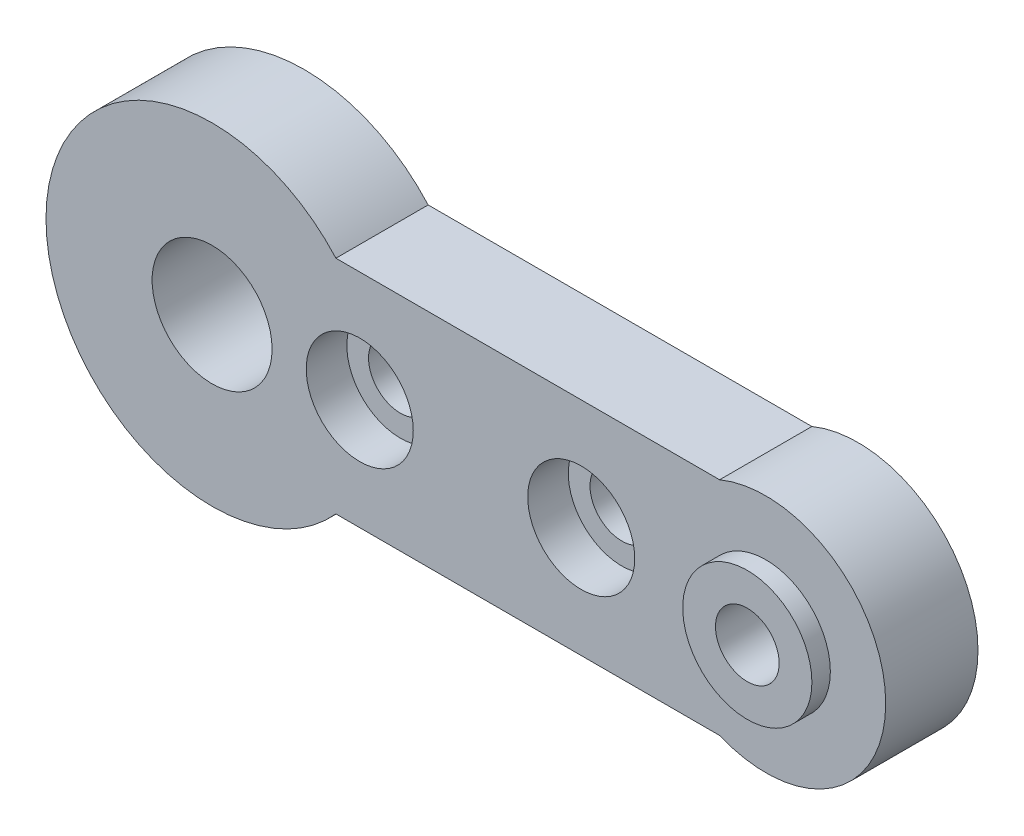
ISO-10303-21;
HEADER;
FILE_DESCRIPTION(('STEP AP214'),'2;1');
FILE_NAME('part.step','',(''),(''),'','','');
FILE_SCHEMA(('AUTOMOTIVE_DESIGN { 1 0 10303 214 1 1 1 1 }'));
ENDSEC;
DATA;
#1=APPLICATION_CONTEXT('core data for automotive mechanical design processes');
#2=APPLICATION_PROTOCOL_DEFINITION('international standard','automotive_design',2000,#1);
#3=PRODUCT_CONTEXT('',#1,'mechanical');
#4=PRODUCT('Part','Part','',(#3));
#5=PRODUCT_RELATED_PRODUCT_CATEGORY('part','',(#4));
#6=PRODUCT_DEFINITION_FORMATION('','',#4);
#7=PRODUCT_DEFINITION_CONTEXT('part definition',#1,'design');
#8=PRODUCT_DEFINITION('design','',#6,#7);
#9=PRODUCT_DEFINITION_SHAPE('','',#8);
#10=(LENGTH_UNIT() NAMED_UNIT(*) SI_UNIT(.MILLI.,.METRE.));
#11=(NAMED_UNIT(*) PLANE_ANGLE_UNIT() SI_UNIT($,.RADIAN.));
#12=(NAMED_UNIT(*) SI_UNIT($,.STERADIAN.) SOLID_ANGLE_UNIT());
#13=UNCERTAINTY_MEASURE_WITH_UNIT(LENGTH_MEASURE(1.E-05),#10,'distance_accuracy_value','');
#14=(GEOMETRIC_REPRESENTATION_CONTEXT(3) GLOBAL_UNCERTAINTY_ASSIGNED_CONTEXT((#13)) GLOBAL_UNIT_ASSIGNED_CONTEXT((#10,
#11,#12)) REPRESENTATION_CONTEXT('',''));
#15=CARTESIAN_POINT('',(0.,0.,0.));
#16=DIRECTION('',(0.,0.,1.));
#17=DIRECTION('',(1.,0.,0.));
#18=AXIS2_PLACEMENT_3D('',#15,#16,#17);
#19=CARTESIAN_POINT('',(20.,0.,-9.));
#20=DIRECTION('',(0.,0.,1.));
#21=DIRECTION('',(1.,0.,0.));
#22=AXIS2_PLACEMENT_3D('',#19,#20,#21);
#23=CYLINDRICAL_SURFACE('',#22,1.725);
#24=CARTESIAN_POINT('',(20.,0.,-9.));
#25=DIRECTION('',(0.,0.,1.));
#26=DIRECTION('',(1.,0.,0.));
#27=AXIS2_PLACEMENT_3D('',#24,#25,#26);
#28=CIRCLE('',#27,1.725);
#29=CARTESIAN_POINT('',(21.725,0.,-9.));
#30=VERTEX_POINT('',#29);
#31=EDGE_CURVE('E113',#30,#30,#28,.T.);
#32=ORIENTED_EDGE('',*,*,#31,.F.);
#33=EDGE_LOOP('',(#32));
#34=FACE_BOUND('',#33,.T.);
#35=CARTESIAN_POINT('',(20.,0.,-6.2));
#36=DIRECTION('',(0.,0.,1.));
#37=DIRECTION('',(1.,0.,0.));
#38=AXIS2_PLACEMENT_3D('',#35,#36,#37);
#39=CIRCLE('',#38,1.725);
#40=CARTESIAN_POINT('',(21.725,0.,-6.2));
#41=VERTEX_POINT('',#40);
#42=EDGE_CURVE('E114',#41,#41,#39,.F.);
#43=ORIENTED_EDGE('',*,*,#42,.F.);
#44=EDGE_LOOP('',(#43));
#45=FACE_BOUND('',#44,.T.);
#46=ADVANCED_FACE('F39',(#34,#45),#23,.F.);
#47=CARTESIAN_POINT('',(8.,0.,-9.));
#48=DIRECTION('',(0.,0.,1.));
#49=DIRECTION('',(1.,0.,0.));
#50=AXIS2_PLACEMENT_3D('',#47,#48,#49);
#51=CYLINDRICAL_SURFACE('',#50,1.725);
#52=CARTESIAN_POINT('',(8.,0.,-9.));
#53=DIRECTION('',(0.,0.,1.));
#54=DIRECTION('',(1.,0.,0.));
#55=AXIS2_PLACEMENT_3D('',#52,#53,#54);
#56=CIRCLE('',#55,1.725);
#57=CARTESIAN_POINT('',(9.725,0.,-9.));
#58=VERTEX_POINT('',#57);
#59=EDGE_CURVE('E136',#58,#58,#56,.T.);
#60=ORIENTED_EDGE('',*,*,#59,.F.);
#61=EDGE_LOOP('',(#60));
#62=FACE_BOUND('',#61,.T.);
#63=CARTESIAN_POINT('',(8.,0.,-6.2));
#64=DIRECTION('',(0.,0.,1.));
#65=DIRECTION('',(1.,0.,0.));
#66=AXIS2_PLACEMENT_3D('',#63,#64,#65);
#67=CIRCLE('',#66,1.725);
#68=CARTESIAN_POINT('',(9.725,0.,-6.2));
#69=VERTEX_POINT('',#68);
#70=EDGE_CURVE('E111',#69,#69,#67,.F.);
#71=ORIENTED_EDGE('',*,*,#70,.F.);
#72=EDGE_LOOP('',(#71));
#73=FACE_BOUND('',#72,.T.);
#74=ADVANCED_FACE('F157',(#62,#73),#51,.F.);
#75=CARTESIAN_POINT('',(0.,-6.,-4.));
#76=DIRECTION('',(0.,1.,0.));
#77=DIRECTION('',(0.,0.,1.));
#78=AXIS2_PLACEMENT_3D('',#75,#76,#77);
#79=PLANE('',#78);
#80=DIRECTION('',(0.,0.,-1.));
#81=VECTOR('',#80,1.);
#82=CARTESIAN_POINT('',(27.5,-6.,-4.));
#83=LINE('',#82,#81);
#84=CARTESIAN_POINT('',(27.5,-6.,-4.));
#85=VERTEX_POINT('',#84);
#86=CARTESIAN_POINT('',(27.5,-6.,-9.));
#87=VERTEX_POINT('',#86);
#88=EDGE_CURVE('E62',#85,#87,#83,.T.);
#89=ORIENTED_EDGE('',*,*,#88,.F.);
#90=DIRECTION('',(1.,0.,0.));
#91=VECTOR('',#90,1.);
#92=CARTESIAN_POINT('',(0.,-6.,-4.));
#93=LINE('',#92,#91);
#94=CARTESIAN_POINT('',(6.70820393249937,-6.,-4.));
#95=VERTEX_POINT('',#94);
#96=EDGE_CURVE('E88',#95,#85,#93,.T.);
#97=ORIENTED_EDGE('',*,*,#96,.F.);
#98=DIRECTION('',(0.,0.,-1.));
#99=VECTOR('',#98,1.);
#100=CARTESIAN_POINT('',(6.70820393249937,-6.,-4.));
#101=LINE('',#100,#99);
#102=CARTESIAN_POINT('',(6.70820393249937,-6.,-9.));
#103=VERTEX_POINT('',#102);
#104=EDGE_CURVE('E100',#103,#95,#101,.F.);
#105=ORIENTED_EDGE('',*,*,#104,.F.);
#106=DIRECTION('',(1.,0.,0.));
#107=VECTOR('',#106,1.);
#108=CARTESIAN_POINT('',(0.,-6.,-9.));
#109=LINE('',#108,#107);
#110=EDGE_CURVE('E90',#103,#87,#109,.T.);
#111=ORIENTED_EDGE('',*,*,#110,.T.);
#112=EDGE_LOOP('',(#89,#97,#105,#111));
#113=FACE_BOUND('',#112,.T.);
#114=ADVANCED_FACE('F41',(#113),#79,.F.);
#115=CARTESIAN_POINT('',(30.,6.,-4.));
#116=DIRECTION('',(0.,-1.,0.));
#117=DIRECTION('',(0.,0.,-1.));
#118=AXIS2_PLACEMENT_3D('',#115,#116,#117);
#119=PLANE('',#118);
#120=DIRECTION('',(0.,0.,-1.));
#121=VECTOR('',#120,1.);
#122=CARTESIAN_POINT('',(27.5,6.,-4.));
#123=LINE('',#122,#121);
#124=CARTESIAN_POINT('',(27.5,6.,-9.));
#125=VERTEX_POINT('',#124);
#126=CARTESIAN_POINT('',(27.5,6.,-4.));
#127=VERTEX_POINT('',#126);
#128=EDGE_CURVE('E85',#125,#127,#123,.F.);
#129=ORIENTED_EDGE('',*,*,#128,.F.);
#130=DIRECTION('',(-1.,0.,0.));
#131=VECTOR('',#130,1.);
#132=CARTESIAN_POINT('',(30.,6.,-9.));
#133=LINE('',#132,#131);
#134=CARTESIAN_POINT('',(6.70820393249937,6.,-9.));
#135=VERTEX_POINT('',#134);
#136=EDGE_CURVE('E79',#125,#135,#133,.T.);
#137=ORIENTED_EDGE('',*,*,#136,.T.);
#138=DIRECTION('',(0.,0.,-1.));
#139=VECTOR('',#138,1.);
#140=CARTESIAN_POINT('',(6.70820393249937,6.,-4.));
#141=LINE('',#140,#139);
#142=CARTESIAN_POINT('',(6.70820393249937,6.,-4.));
#143=VERTEX_POINT('',#142);
#144=EDGE_CURVE('E84',#143,#135,#141,.T.);
#145=ORIENTED_EDGE('',*,*,#144,.F.);
#146=DIRECTION('',(-1.,0.,0.));
#147=VECTOR('',#146,1.);
#148=CARTESIAN_POINT('',(30.,6.,-4.));
#149=LINE('',#148,#147);
#150=EDGE_CURVE('E48',#127,#143,#149,.T.);
#151=ORIENTED_EDGE('',*,*,#150,.F.);
#152=EDGE_LOOP('',(#129,#137,#145,#151));
#153=FACE_BOUND('',#152,.T.);
#154=ADVANCED_FACE('F83',(#153),#119,.F.);
#155=CARTESIAN_POINT('',(0.,0.,-4.));
#156=DIRECTION('',(0.,0.,1.));
#157=DIRECTION('',(1.,0.,0.));
#158=AXIS2_PLACEMENT_3D('',#155,#156,#157);
#159=PLANE('',#158);
#160=CARTESIAN_POINT('',(30.,0.,-4.));
#161=DIRECTION('',(0.,0.,1.));
#162=DIRECTION('',(1.,0.,0.));
#163=AXIS2_PLACEMENT_3D('',#160,#161,#162);
#164=CIRCLE('',#163,3.5);
#165=CARTESIAN_POINT('',(33.5,0.,-4.));
#166=VERTEX_POINT('',#165);
#167=EDGE_CURVE('E11',#166,#166,#164,.T.);
#168=ORIENTED_EDGE('',*,*,#167,.F.);
#169=EDGE_LOOP('',(#168));
#170=FACE_BOUND('',#169,.T.);
#171=CARTESIAN_POINT('',(20.,0.,-4.));
#172=DIRECTION('',(0.,0.,1.));
#173=DIRECTION('',(1.,0.,0.));
#174=AXIS2_PLACEMENT_3D('',#171,#172,#173);
#175=CIRCLE('',#174,2.9);
#176=CARTESIAN_POINT('',(22.9,0.,-4.));
#177=VERTEX_POINT('',#176);
#178=EDGE_CURVE('E117',#177,#177,#175,.T.);
#179=ORIENTED_EDGE('',*,*,#178,.F.);
#180=EDGE_LOOP('',(#179));
#181=FACE_BOUND('',#180,.T.);
#182=CARTESIAN_POINT('',(8.,0.,-4.));
#183=DIRECTION('',(0.,0.,1.));
#184=DIRECTION('',(1.,0.,0.));
#185=AXIS2_PLACEMENT_3D('',#182,#183,#184);
#186=CIRCLE('',#185,2.9);
#187=CARTESIAN_POINT('',(10.9,0.,-4.));
#188=VERTEX_POINT('',#187);
#189=EDGE_CURVE('E112',#188,#188,#186,.T.);
#190=ORIENTED_EDGE('',*,*,#189,.F.);
#191=EDGE_LOOP('',(#190));
#192=FACE_BOUND('',#191,.T.);
#193=CARTESIAN_POINT('',(0.,0.,-4.));
#194=DIRECTION('',(0.,0.,1.));
#195=DIRECTION('',(1.,0.,0.));
#196=AXIS2_PLACEMENT_3D('',#193,#194,#195);
#197=CIRCLE('',#196,3.25);
#198=CARTESIAN_POINT('',(3.25,0.,-4.));
#199=VERTEX_POINT('',#198);
#200=EDGE_CURVE('E144',#199,#199,#197,.T.);
#201=ORIENTED_EDGE('',*,*,#200,.F.);
#202=EDGE_LOOP('',(#201));
#203=FACE_BOUND('',#202,.T.);
#204=CARTESIAN_POINT('',(30.,0.,-4.));
#205=DIRECTION('',(0.,0.,1.));
#206=DIRECTION('',(1.,0.,0.));
#207=AXIS2_PLACEMENT_3D('',#204,#205,#206);
#208=CIRCLE('',#207,6.5);
#209=EDGE_CURVE('E147',#85,#127,#208,.T.);
#210=ORIENTED_EDGE('',*,*,#209,.T.);
#211=ORIENTED_EDGE('',*,*,#150,.T.);
#212=CARTESIAN_POINT('',(0.,0.,-4.));
#213=DIRECTION('',(0.,0.,1.));
#214=DIRECTION('',(1.,0.,0.));
#215=AXIS2_PLACEMENT_3D('',#212,#213,#214);
#216=CIRCLE('',#215,9.);
#217=EDGE_CURVE('E96',#143,#95,#216,.T.);
#218=ORIENTED_EDGE('',*,*,#217,.T.);
#219=ORIENTED_EDGE('',*,*,#96,.T.);
#220=EDGE_LOOP('',(#210,#211,#218,#219));
#221=FACE_BOUND('',#220,.T.);
#222=ADVANCED_FACE('F156',(#170,#181,#192,#203,#221),#159,.T.);
#223=CARTESIAN_POINT('',(0.,0.,-9.));
#224=DIRECTION('',(0.,0.,1.));
#225=DIRECTION('',(1.,0.,0.));
#226=AXIS2_PLACEMENT_3D('',#223,#224,#225);
#227=PLANE('',#226);
#228=CARTESIAN_POINT('',(30.,0.,-9.));
#229=DIRECTION('',(0.,0.,1.));
#230=DIRECTION('',(1.,0.,0.));
#231=AXIS2_PLACEMENT_3D('',#228,#229,#230);
#232=CIRCLE('',#231,2.9);
#233=CARTESIAN_POINT('',(32.9,0.,-9.));
#234=VERTEX_POINT('',#233);
#235=EDGE_CURVE('E131',#234,#234,#232,.T.);
#236=ORIENTED_EDGE('',*,*,#235,.T.);
#237=EDGE_LOOP('',(#236));
#238=FACE_BOUND('',#237,.T.);
#239=ORIENTED_EDGE('',*,*,#59,.T.);
#240=EDGE_LOOP('',(#239));
#241=FACE_BOUND('',#240,.T.);
#242=ORIENTED_EDGE('',*,*,#31,.T.);
#243=EDGE_LOOP('',(#242));
#244=FACE_BOUND('',#243,.T.);
#245=CARTESIAN_POINT('',(0.,0.,-9.));
#246=DIRECTION('',(0.,0.,1.));
#247=DIRECTION('',(1.,0.,0.));
#248=AXIS2_PLACEMENT_3D('',#245,#246,#247);
#249=CIRCLE('',#248,3.25);
#250=CARTESIAN_POINT('',(3.25,0.,-9.));
#251=VERTEX_POINT('',#250);
#252=EDGE_CURVE('E138',#251,#251,#249,.T.);
#253=ORIENTED_EDGE('',*,*,#252,.T.);
#254=EDGE_LOOP('',(#253));
#255=FACE_BOUND('',#254,.T.);
#256=ORIENTED_EDGE('',*,*,#136,.F.);
#257=CARTESIAN_POINT('',(30.,0.,-9.));
#258=DIRECTION('',(0.,0.,1.));
#259=DIRECTION('',(1.,0.,0.));
#260=AXIS2_PLACEMENT_3D('',#257,#258,#259);
#261=CIRCLE('',#260,6.5);
#262=EDGE_CURVE('E149',#87,#125,#261,.T.);
#263=ORIENTED_EDGE('',*,*,#262,.F.);
#264=ORIENTED_EDGE('',*,*,#110,.F.);
#265=CARTESIAN_POINT('',(0.,0.,-9.));
#266=DIRECTION('',(0.,0.,1.));
#267=DIRECTION('',(1.,0.,0.));
#268=AXIS2_PLACEMENT_3D('',#265,#266,#267);
#269=CIRCLE('',#268,9.);
#270=EDGE_CURVE('E98',#135,#103,#269,.T.);
#271=ORIENTED_EDGE('',*,*,#270,.F.);
#272=EDGE_LOOP('',(#256,#263,#264,#271));
#273=FACE_BOUND('',#272,.T.);
#274=ADVANCED_FACE('F105',(#238,#241,#244,#255,#273),#227,.F.);
#275=CARTESIAN_POINT('',(0.,0.,-4.));
#276=DIRECTION('',(0.,0.,-1.));
#277=DIRECTION('',(-1.,0.,0.));
#278=AXIS2_PLACEMENT_3D('',#275,#276,#277);
#279=CYLINDRICAL_SURFACE('',#278,9.);
#280=ORIENTED_EDGE('',*,*,#270,.T.);
#281=ORIENTED_EDGE('',*,*,#104,.T.);
#282=ORIENTED_EDGE('',*,*,#217,.F.);
#283=ORIENTED_EDGE('',*,*,#144,.T.);
#284=EDGE_LOOP('',(#280,#281,#282,#283));
#285=FACE_BOUND('',#284,.T.);
#286=ADVANCED_FACE('F93',(#285),#279,.T.);
#287=CARTESIAN_POINT('',(30.,0.,-4.));
#288=DIRECTION('',(0.,0.,-1.));
#289=DIRECTION('',(-1.,0.,0.));
#290=AXIS2_PLACEMENT_3D('',#287,#288,#289);
#291=CYLINDRICAL_SURFACE('',#290,6.5);
#292=ORIENTED_EDGE('',*,*,#209,.F.);
#293=ORIENTED_EDGE('',*,*,#88,.T.);
#294=ORIENTED_EDGE('',*,*,#262,.T.);
#295=ORIENTED_EDGE('',*,*,#128,.T.);
#296=EDGE_LOOP('',(#292,#293,#294,#295));
#297=FACE_BOUND('',#296,.T.);
#298=ADVANCED_FACE('F153',(#297),#291,.T.);
#299=CARTESIAN_POINT('',(0.,0.,-9.));
#300=DIRECTION('',(0.,0.,1.));
#301=DIRECTION('',(1.,0.,0.));
#302=AXIS2_PLACEMENT_3D('',#299,#300,#301);
#303=CYLINDRICAL_SURFACE('',#302,3.25);
#304=ORIENTED_EDGE('',*,*,#200,.T.);
#305=EDGE_LOOP('',(#304));
#306=FACE_BOUND('',#305,.T.);
#307=ORIENTED_EDGE('',*,*,#252,.F.);
#308=EDGE_LOOP('',(#307));
#309=FACE_BOUND('',#308,.T.);
#310=ADVANCED_FACE('F181',(#306,#309),#303,.F.);
#311=CARTESIAN_POINT('',(30.,0.,-9.));
#312=DIRECTION('',(0.,0.,1.));
#313=DIRECTION('',(1.,0.,0.));
#314=AXIS2_PLACEMENT_3D('',#311,#312,#313);
#315=CYLINDRICAL_SURFACE('',#314,1.725);
#316=CARTESIAN_POINT('',(30.,0.,-6.8));
#317=DIRECTION('',(0.,0.,1.));
#318=DIRECTION('',(1.,0.,0.));
#319=AXIS2_PLACEMENT_3D('',#316,#317,#318);
#320=CIRCLE('',#319,1.725);
#321=CARTESIAN_POINT('',(31.725,0.,-6.8));
#322=VERTEX_POINT('',#321);
#323=EDGE_CURVE('E43',#322,#322,#320,.F.);
#324=ORIENTED_EDGE('',*,*,#323,.T.);
#325=EDGE_LOOP('',(#324));
#326=FACE_BOUND('',#325,.T.);
#327=CARTESIAN_POINT('',(30.,0.,-3.));
#328=DIRECTION('',(0.,0.,1.));
#329=DIRECTION('',(1.,0.,0.));
#330=AXIS2_PLACEMENT_3D('',#327,#328,#329);
#331=CIRCLE('',#330,1.725);
#332=CARTESIAN_POINT('',(31.725,0.,-3.));
#333=VERTEX_POINT('',#332);
#334=EDGE_CURVE('E241',#333,#333,#331,.T.);
#335=ORIENTED_EDGE('',*,*,#334,.T.);
#336=EDGE_LOOP('',(#335));
#337=FACE_BOUND('',#336,.T.);
#338=ADVANCED_FACE('F180',(#326,#337),#315,.F.);
#339=CARTESIAN_POINT('',(8.,0.,-6.2));
#340=DIRECTION('',(0.,0.,1.));
#341=DIRECTION('',(1.,0.,0.));
#342=AXIS2_PLACEMENT_3D('',#339,#340,#341);
#343=PLANE('',#342);
#344=CARTESIAN_POINT('',(8.,0.,-6.2));
#345=DIRECTION('',(0.,0.,1.));
#346=DIRECTION('',(1.,0.,0.));
#347=AXIS2_PLACEMENT_3D('',#344,#345,#346);
#348=CIRCLE('',#347,2.9);
#349=CARTESIAN_POINT('',(10.9,0.,-6.2));
#350=VERTEX_POINT('',#349);
#351=EDGE_CURVE('E120',#350,#350,#348,.T.);
#352=ORIENTED_EDGE('',*,*,#351,.T.);
#353=EDGE_LOOP('',(#352));
#354=FACE_BOUND('',#353,.T.);
#355=ORIENTED_EDGE('',*,*,#70,.T.);
#356=EDGE_LOOP('',(#355));
#357=FACE_BOUND('',#356,.T.);
#358=ADVANCED_FACE('F179',(#354,#357),#343,.T.);
#359=CARTESIAN_POINT('',(8.,0.,-4.));
#360=DIRECTION('',(0.,0.,-1.));
#361=DIRECTION('',(-1.,0.,0.));
#362=AXIS2_PLACEMENT_3D('',#359,#360,#361);
#363=CYLINDRICAL_SURFACE('',#362,2.9);
#364=ORIENTED_EDGE('',*,*,#189,.T.);
#365=EDGE_LOOP('',(#364));
#366=FACE_BOUND('',#365,.T.);
#367=ORIENTED_EDGE('',*,*,#351,.F.);
#368=EDGE_LOOP('',(#367));
#369=FACE_BOUND('',#368,.T.);
#370=ADVANCED_FACE('F208',(#366,#369),#363,.F.);
#371=CARTESIAN_POINT('',(20.,0.,-6.2));
#372=DIRECTION('',(0.,0.,1.));
#373=DIRECTION('',(1.,0.,0.));
#374=AXIS2_PLACEMENT_3D('',#371,#372,#373);
#375=PLANE('',#374);
#376=CARTESIAN_POINT('',(20.,0.,-6.2));
#377=DIRECTION('',(0.,0.,1.));
#378=DIRECTION('',(1.,0.,0.));
#379=AXIS2_PLACEMENT_3D('',#376,#377,#378);
#380=CIRCLE('',#379,2.9);
#381=CARTESIAN_POINT('',(22.9,0.,-6.2));
#382=VERTEX_POINT('',#381);
#383=EDGE_CURVE('E121',#382,#382,#380,.T.);
#384=ORIENTED_EDGE('',*,*,#383,.T.);
#385=EDGE_LOOP('',(#384));
#386=FACE_BOUND('',#385,.T.);
#387=ORIENTED_EDGE('',*,*,#42,.T.);
#388=EDGE_LOOP('',(#387));
#389=FACE_BOUND('',#388,.T.);
#390=ADVANCED_FACE('F211',(#386,#389),#375,.T.);
#391=CARTESIAN_POINT('',(20.,0.,-4.));
#392=DIRECTION('',(0.,0.,-1.));
#393=DIRECTION('',(-1.,0.,0.));
#394=AXIS2_PLACEMENT_3D('',#391,#392,#393);
#395=CYLINDRICAL_SURFACE('',#394,2.9);
#396=ORIENTED_EDGE('',*,*,#178,.T.);
#397=EDGE_LOOP('',(#396));
#398=FACE_BOUND('',#397,.T.);
#399=ORIENTED_EDGE('',*,*,#383,.F.);
#400=EDGE_LOOP('',(#399));
#401=FACE_BOUND('',#400,.T.);
#402=ADVANCED_FACE('F219',(#398,#401),#395,.F.);
#403=CARTESIAN_POINT('',(30.,0.,-6.8));
#404=DIRECTION('',(0.,0.,1.));
#405=DIRECTION('',(1.,0.,0.));
#406=AXIS2_PLACEMENT_3D('',#403,#404,#405);
#407=PLANE('',#406);
#408=CARTESIAN_POINT('',(30.,0.,-6.8));
#409=DIRECTION('',(0.,0.,1.));
#410=DIRECTION('',(1.,0.,0.));
#411=AXIS2_PLACEMENT_3D('',#408,#409,#410);
#412=CIRCLE('',#411,2.9);
#413=CARTESIAN_POINT('',(32.9,0.,-6.8));
#414=VERTEX_POINT('',#413);
#415=EDGE_CURVE('E246',#414,#414,#412,.T.);
#416=ORIENTED_EDGE('',*,*,#415,.F.);
#417=EDGE_LOOP('',(#416));
#418=FACE_BOUND('',#417,.T.);
#419=ORIENTED_EDGE('',*,*,#323,.F.);
#420=EDGE_LOOP('',(#419));
#421=FACE_BOUND('',#420,.T.);
#422=ADVANCED_FACE('F220',(#418,#421),#407,.F.);
#423=CARTESIAN_POINT('',(30.,0.,-6.8));
#424=DIRECTION('',(0.,0.,-1.));
#425=DIRECTION('',(-1.,0.,0.));
#426=AXIS2_PLACEMENT_3D('',#423,#424,#425);
#427=CYLINDRICAL_SURFACE('',#426,2.9);
#428=ORIENTED_EDGE('',*,*,#415,.T.);
#429=EDGE_LOOP('',(#428));
#430=FACE_BOUND('',#429,.T.);
#431=ORIENTED_EDGE('',*,*,#235,.F.);
#432=EDGE_LOOP('',(#431));
#433=FACE_BOUND('',#432,.T.);
#434=ADVANCED_FACE('F222',(#430,#433),#427,.F.);
#435=CARTESIAN_POINT('',(30.,0.,-3.));
#436=DIRECTION('',(0.,0.,1.));
#437=DIRECTION('',(1.,0.,0.));
#438=AXIS2_PLACEMENT_3D('',#435,#436,#437);
#439=PLANE('',#438);
#440=ORIENTED_EDGE('',*,*,#334,.F.);
#441=EDGE_LOOP('',(#440));
#442=FACE_BOUND('',#441,.T.);
#443=CARTESIAN_POINT('',(30.,0.,-3.));
#444=DIRECTION('',(0.,0.,1.));
#445=DIRECTION('',(1.,0.,0.));
#446=AXIS2_PLACEMENT_3D('',#443,#444,#445);
#447=CIRCLE('',#446,3.5);
#448=CARTESIAN_POINT('',(33.5,0.,-3.));
#449=VERTEX_POINT('',#448);
#450=EDGE_CURVE('E242',#449,#449,#447,.T.);
#451=ORIENTED_EDGE('',*,*,#450,.T.);
#452=EDGE_LOOP('',(#451));
#453=FACE_BOUND('',#452,.T.);
#454=ADVANCED_FACE('F228',(#442,#453),#439,.T.);
#455=CARTESIAN_POINT('',(30.,0.,-3.));
#456=DIRECTION('',(0.,0.,-1.));
#457=DIRECTION('',(-1.,0.,0.));
#458=AXIS2_PLACEMENT_3D('',#455,#456,#457);
#459=CYLINDRICAL_SURFACE('',#458,3.5);
#460=ORIENTED_EDGE('',*,*,#450,.F.);
#461=EDGE_LOOP('',(#460));
#462=FACE_BOUND('',#461,.T.);
#463=ORIENTED_EDGE('',*,*,#167,.T.);
#464=EDGE_LOOP('',(#463));
#465=FACE_BOUND('',#464,.T.);
#466=ADVANCED_FACE('F229',(#462,#465),#459,.T.);
#467=CLOSED_SHELL('',(#46,#74,#114,#154,#222,#274,#286,#298,#310,#338,#358,#370,#390,#402,#422,
#434,#454,#466));
#468=MANIFOLD_SOLID_BREP('B2',#467);
#469=ADVANCED_BREP_SHAPE_REPRESENTATION('',(#18,#468),#14);
#470=SHAPE_DEFINITION_REPRESENTATION(#9,#469);
ENDSEC;
END-ISO-10303-21;
